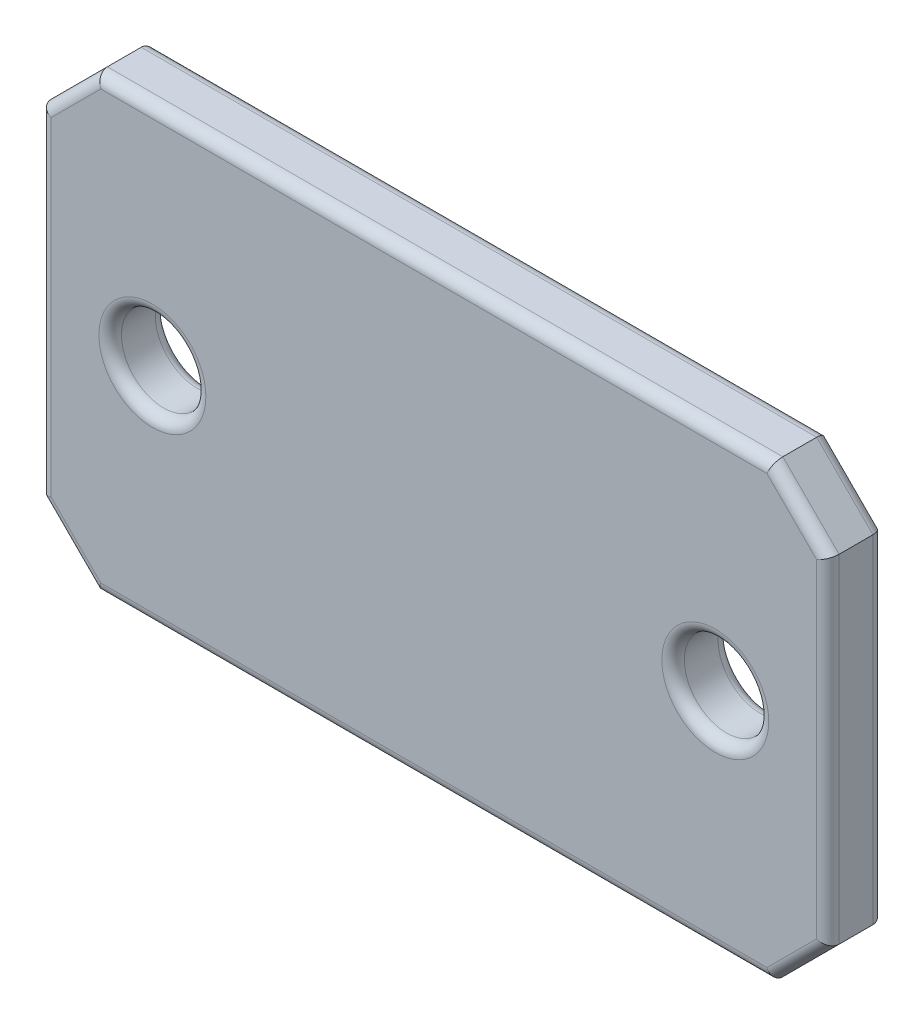
ISO-10303-21;
HEADER;
FILE_DESCRIPTION(('STEP AP214'),'2;1');
FILE_NAME('part.step','',(''),(''),'','','');
FILE_SCHEMA(('AUTOMOTIVE_DESIGN { 1 0 10303 214 1 1 1 1 }'));
ENDSEC;
DATA;
#1=APPLICATION_CONTEXT('core data for automotive mechanical design processes');
#2=APPLICATION_PROTOCOL_DEFINITION('international standard','automotive_design',2000,#1);
#3=PRODUCT_CONTEXT('',#1,'mechanical');
#4=PRODUCT('Part','Part','',(#3));
#5=PRODUCT_RELATED_PRODUCT_CATEGORY('part','',(#4));
#6=PRODUCT_DEFINITION_FORMATION('','',#4);
#7=PRODUCT_DEFINITION_CONTEXT('part definition',#1,'design');
#8=PRODUCT_DEFINITION('design','',#6,#7);
#9=PRODUCT_DEFINITION_SHAPE('','',#8);
#10=(LENGTH_UNIT() NAMED_UNIT(*) SI_UNIT(.MILLI.,.METRE.));
#11=(NAMED_UNIT(*) PLANE_ANGLE_UNIT() SI_UNIT($,.RADIAN.));
#12=(NAMED_UNIT(*) SI_UNIT($,.STERADIAN.) SOLID_ANGLE_UNIT());
#13=UNCERTAINTY_MEASURE_WITH_UNIT(LENGTH_MEASURE(1.E-05),#10,'distance_accuracy_value','');
#14=(GEOMETRIC_REPRESENTATION_CONTEXT(3) GLOBAL_UNCERTAINTY_ASSIGNED_CONTEXT((#13)) GLOBAL_UNIT_ASSIGNED_CONTEXT((#10,
#11,#12)) REPRESENTATION_CONTEXT('',''));
#15=CARTESIAN_POINT('',(0.,0.,0.));
#16=DIRECTION('',(0.,0.,1.));
#17=DIRECTION('',(1.,0.,0.));
#18=AXIS2_PLACEMENT_3D('',#15,#16,#17);
#19=CARTESIAN_POINT('',(22.225,9.52499999999999,3.175));
#20=DIRECTION('',(-0.707106781186548,-0.707106781186547,0.));
#21=DIRECTION('',(0.707106781186547,-0.707106781186548,0.));
#22=AXIS2_PLACEMENT_3D('',#19,#20,#21);
#23=PLANE('',#22);
#24=DIRECTION('',(0.,0.,-1.));
#25=VECTOR('',#24,1.);
#26=CARTESIAN_POINT('',(22.225,9.52499999999999,3.175));
#27=LINE('',#26,#25);
#28=CARTESIAN_POINT('',(22.225,9.52499999999999,2.54));
#29=VERTEX_POINT('',#28);
#30=CARTESIAN_POINT('',(22.225,9.52499999999999,0.635));
#31=VERTEX_POINT('',#30);
#32=EDGE_CURVE('E291',#29,#31,#27,.T.);
#33=ORIENTED_EDGE('',*,*,#32,.T.);
#34=DIRECTION('',(-0.707106781186547,0.707106781186548,0.));
#35=VECTOR('',#34,1.);
#36=CARTESIAN_POINT('',(22.225,9.52499999999999,0.635));
#37=LINE('',#36,#35);
#38=CARTESIAN_POINT('',(19.05,12.7,0.635));
#39=VERTEX_POINT('',#38);
#40=EDGE_CURVE('E238',#31,#39,#37,.T.);
#41=ORIENTED_EDGE('',*,*,#40,.T.);
#42=DIRECTION('',(0.,0.,-1.));
#43=VECTOR('',#42,1.);
#44=CARTESIAN_POINT('',(19.05,12.7,3.175));
#45=LINE('',#44,#43);
#46=CARTESIAN_POINT('',(19.05,12.7,2.54));
#47=VERTEX_POINT('',#46);
#48=EDGE_CURVE('E171',#47,#39,#45,.T.);
#49=ORIENTED_EDGE('',*,*,#48,.F.);
#50=DIRECTION('',(-0.707106781186547,0.707106781186548,0.));
#51=VECTOR('',#50,1.);
#52=CARTESIAN_POINT('',(22.225,9.52499999999999,2.54));
#53=LINE('',#52,#51);
#54=EDGE_CURVE('E236',#47,#29,#53,.F.);
#55=ORIENTED_EDGE('',*,*,#54,.T.);
#56=EDGE_LOOP('',(#33,#41,#49,#55));
#57=FACE_BOUND('',#56,.T.);
#58=ADVANCED_FACE('F35',(#57),#23,.F.);
#59=CARTESIAN_POINT('',(19.05,12.7,3.175));
#60=DIRECTION('',(0.,-1.,0.));
#61=DIRECTION('',(0.,0.,-1.));
#62=AXIS2_PLACEMENT_3D('',#59,#60,#61);
#63=PLANE('',#62);
#64=ORIENTED_EDGE('',*,*,#48,.T.);
#65=DIRECTION('',(-1.,0.,0.));
#66=VECTOR('',#65,1.);
#67=CARTESIAN_POINT('',(19.05,12.7,0.635));
#68=LINE('',#67,#66);
#69=CARTESIAN_POINT('',(-19.05,12.7,0.635));
#70=VERTEX_POINT('',#69);
#71=EDGE_CURVE('E170',#39,#70,#68,.T.);
#72=ORIENTED_EDGE('',*,*,#71,.T.);
#73=DIRECTION('',(0.,0.,-1.));
#74=VECTOR('',#73,1.);
#75=CARTESIAN_POINT('',(-19.05,12.7,3.175));
#76=LINE('',#75,#74);
#77=CARTESIAN_POINT('',(-19.05,12.7,2.54));
#78=VERTEX_POINT('',#77);
#79=EDGE_CURVE('E152',#78,#70,#76,.T.);
#80=ORIENTED_EDGE('',*,*,#79,.F.);
#81=DIRECTION('',(-1.,0.,0.));
#82=VECTOR('',#81,1.);
#83=CARTESIAN_POINT('',(19.05,12.7,2.54));
#84=LINE('',#83,#82);
#85=EDGE_CURVE('E167',#78,#47,#84,.F.);
#86=ORIENTED_EDGE('',*,*,#85,.T.);
#87=EDGE_LOOP('',(#64,#72,#80,#86));
#88=FACE_BOUND('',#87,.T.);
#89=ADVANCED_FACE('F165',(#88),#63,.F.);
#90=CARTESIAN_POINT('',(-19.05,12.7,3.175));
#91=DIRECTION('',(0.707106781186547,-0.707106781186548,0.));
#92=DIRECTION('',(0.707106781186548,0.707106781186547,0.));
#93=AXIS2_PLACEMENT_3D('',#90,#91,#92);
#94=PLANE('',#93);
#95=ORIENTED_EDGE('',*,*,#79,.T.);
#96=DIRECTION('',(-0.707106781186548,-0.707106781186547,0.));
#97=VECTOR('',#96,1.);
#98=CARTESIAN_POINT('',(-19.05,12.7,0.635));
#99=LINE('',#98,#97);
#100=CARTESIAN_POINT('',(-22.225,9.525,0.635));
#101=VERTEX_POINT('',#100);
#102=EDGE_CURVE('E159',#70,#101,#99,.T.);
#103=ORIENTED_EDGE('',*,*,#102,.T.);
#104=DIRECTION('',(0.,0.,-1.));
#105=VECTOR('',#104,1.);
#106=CARTESIAN_POINT('',(-22.225,9.525,3.175));
#107=LINE('',#106,#105);
#108=CARTESIAN_POINT('',(-22.225,9.525,2.54));
#109=VERTEX_POINT('',#108);
#110=EDGE_CURVE('E154',#109,#101,#107,.T.);
#111=ORIENTED_EDGE('',*,*,#110,.F.);
#112=DIRECTION('',(-0.707106781186548,-0.707106781186547,0.));
#113=VECTOR('',#112,1.);
#114=CARTESIAN_POINT('',(-19.05,12.7,2.54));
#115=LINE('',#114,#113);
#116=EDGE_CURVE('E149',#109,#78,#115,.F.);
#117=ORIENTED_EDGE('',*,*,#116,.T.);
#118=EDGE_LOOP('',(#95,#103,#111,#117));
#119=FACE_BOUND('',#118,.T.);
#120=ADVANCED_FACE('F151',(#119),#94,.F.);
#121=CARTESIAN_POINT('',(-22.225,9.525,3.175));
#122=DIRECTION('',(1.,0.,0.));
#123=DIRECTION('',(0.,0.,-1.));
#124=AXIS2_PLACEMENT_3D('',#121,#122,#123);
#125=PLANE('',#124);
#126=ORIENTED_EDGE('',*,*,#110,.T.);
#127=DIRECTION('',(0.,-1.,0.));
#128=VECTOR('',#127,1.);
#129=CARTESIAN_POINT('',(-22.225,9.525,0.635));
#130=LINE('',#129,#128);
#131=CARTESIAN_POINT('',(-22.225,-9.52499999999998,0.635));
#132=VERTEX_POINT('',#131);
#133=EDGE_CURVE('E217',#101,#132,#130,.T.);
#134=ORIENTED_EDGE('',*,*,#133,.T.);
#135=DIRECTION('',(0.,0.,-1.));
#136=VECTOR('',#135,1.);
#137=CARTESIAN_POINT('',(-22.225,-9.52499999999998,3.175));
#138=LINE('',#137,#136);
#139=CARTESIAN_POINT('',(-22.225,-9.52499999999998,2.54));
#140=VERTEX_POINT('',#139);
#141=EDGE_CURVE('E317',#140,#132,#138,.T.);
#142=ORIENTED_EDGE('',*,*,#141,.F.);
#143=DIRECTION('',(0.,-1.,0.));
#144=VECTOR('',#143,1.);
#145=CARTESIAN_POINT('',(-22.225,9.525,2.54));
#146=LINE('',#145,#144);
#147=EDGE_CURVE('E215',#140,#109,#146,.F.);
#148=ORIENTED_EDGE('',*,*,#147,.T.);
#149=EDGE_LOOP('',(#126,#134,#142,#148));
#150=FACE_BOUND('',#149,.T.);
#151=ADVANCED_FACE('F314',(#150),#125,.F.);
#152=CARTESIAN_POINT('',(-22.225,-9.52499999999998,3.175));
#153=DIRECTION('',(0.707106781186548,0.707106781186547,0.));
#154=DIRECTION('',(-0.707106781186547,0.707106781186548,0.));
#155=AXIS2_PLACEMENT_3D('',#152,#153,#154);
#156=PLANE('',#155);
#157=ORIENTED_EDGE('',*,*,#141,.T.);
#158=DIRECTION('',(0.707106781186547,-0.707106781186548,0.));
#159=VECTOR('',#158,1.);
#160=CARTESIAN_POINT('',(-22.225,-9.52499999999998,0.635));
#161=LINE('',#160,#159);
#162=CARTESIAN_POINT('',(-19.05,-12.7,0.635));
#163=VERTEX_POINT('',#162);
#164=EDGE_CURVE('E221',#132,#163,#161,.T.);
#165=ORIENTED_EDGE('',*,*,#164,.T.);
#166=DIRECTION('',(0.,0.,-1.));
#167=VECTOR('',#166,1.);
#168=CARTESIAN_POINT('',(-19.05,-12.7,3.175));
#169=LINE('',#168,#167);
#170=CARTESIAN_POINT('',(-19.05,-12.7,2.54));
#171=VERTEX_POINT('',#170);
#172=EDGE_CURVE('E320',#171,#163,#169,.T.);
#173=ORIENTED_EDGE('',*,*,#172,.F.);
#174=DIRECTION('',(0.707106781186547,-0.707106781186548,0.));
#175=VECTOR('',#174,1.);
#176=CARTESIAN_POINT('',(-22.225,-9.52499999999998,2.54));
#177=LINE('',#176,#175);
#178=EDGE_CURVE('E219',#171,#140,#177,.F.);
#179=ORIENTED_EDGE('',*,*,#178,.T.);
#180=EDGE_LOOP('',(#157,#165,#173,#179));
#181=FACE_BOUND('',#180,.T.);
#182=ADVANCED_FACE('F365',(#181),#156,.F.);
#183=CARTESIAN_POINT('',(-19.05,-12.7,3.175));
#184=DIRECTION('',(0.,1.,0.));
#185=DIRECTION('',(0.,0.,1.));
#186=AXIS2_PLACEMENT_3D('',#183,#184,#185);
#187=PLANE('',#186);
#188=ORIENTED_EDGE('',*,*,#172,.T.);
#189=DIRECTION('',(1.,0.,0.));
#190=VECTOR('',#189,1.);
#191=CARTESIAN_POINT('',(-19.05,-12.7,0.635));
#192=LINE('',#191,#190);
#193=CARTESIAN_POINT('',(19.05,-12.7,0.635));
#194=VERTEX_POINT('',#193);
#195=EDGE_CURVE('E225',#163,#194,#192,.T.);
#196=ORIENTED_EDGE('',*,*,#195,.T.);
#197=DIRECTION('',(0.,0.,-1.));
#198=VECTOR('',#197,1.);
#199=CARTESIAN_POINT('',(19.05,-12.7,3.175));
#200=LINE('',#199,#198);
#201=CARTESIAN_POINT('',(19.05,-12.7,2.54));
#202=VERTEX_POINT('',#201);
#203=EDGE_CURVE('E324',#202,#194,#200,.T.);
#204=ORIENTED_EDGE('',*,*,#203,.F.);
#205=DIRECTION('',(1.,0.,0.));
#206=VECTOR('',#205,1.);
#207=CARTESIAN_POINT('',(-19.05,-12.7,2.54));
#208=LINE('',#207,#206);
#209=EDGE_CURVE('E223',#202,#171,#208,.F.);
#210=ORIENTED_EDGE('',*,*,#209,.T.);
#211=EDGE_LOOP('',(#188,#196,#204,#210));
#212=FACE_BOUND('',#211,.T.);
#213=ADVANCED_FACE('F368',(#212),#187,.F.);
#214=CARTESIAN_POINT('',(19.05,-12.7,3.175));
#215=DIRECTION('',(-0.707106781186547,0.707106781186548,0.));
#216=DIRECTION('',(-0.707106781186548,-0.707106781186547,0.));
#217=AXIS2_PLACEMENT_3D('',#214,#215,#216);
#218=PLANE('',#217);
#219=ORIENTED_EDGE('',*,*,#203,.T.);
#220=DIRECTION('',(0.707106781186548,0.707106781186547,0.));
#221=VECTOR('',#220,1.);
#222=CARTESIAN_POINT('',(19.05,-12.7,0.635));
#223=LINE('',#222,#221);
#224=CARTESIAN_POINT('',(22.225,-9.525,0.635));
#225=VERTEX_POINT('',#224);
#226=EDGE_CURVE('E229',#194,#225,#223,.T.);
#227=ORIENTED_EDGE('',*,*,#226,.T.);
#228=DIRECTION('',(0.,0.,-1.));
#229=VECTOR('',#228,1.);
#230=CARTESIAN_POINT('',(22.225,-9.525,3.175));
#231=LINE('',#230,#229);
#232=CARTESIAN_POINT('',(22.225,-9.525,2.54));
#233=VERTEX_POINT('',#232);
#234=EDGE_CURVE('E329',#233,#225,#231,.T.);
#235=ORIENTED_EDGE('',*,*,#234,.F.);
#236=DIRECTION('',(0.707106781186548,0.707106781186547,0.));
#237=VECTOR('',#236,1.);
#238=CARTESIAN_POINT('',(19.05,-12.7,2.54));
#239=LINE('',#238,#237);
#240=EDGE_CURVE('E227',#233,#202,#239,.F.);
#241=ORIENTED_EDGE('',*,*,#240,.T.);
#242=EDGE_LOOP('',(#219,#227,#235,#241));
#243=FACE_BOUND('',#242,.T.);
#244=ADVANCED_FACE('F382',(#243),#218,.F.);
#245=CARTESIAN_POINT('',(22.225,-9.525,3.175));
#246=DIRECTION('',(-1.,0.,0.));
#247=DIRECTION('',(0.,-1.,0.));
#248=AXIS2_PLACEMENT_3D('',#245,#246,#247);
#249=PLANE('',#248);
#250=ORIENTED_EDGE('',*,*,#234,.T.);
#251=DIRECTION('',(0.,1.,0.));
#252=VECTOR('',#251,1.);
#253=CARTESIAN_POINT('',(22.225,-9.525,0.635));
#254=LINE('',#253,#252);
#255=EDGE_CURVE('E234',#225,#31,#254,.T.);
#256=ORIENTED_EDGE('',*,*,#255,.T.);
#257=ORIENTED_EDGE('',*,*,#32,.F.);
#258=DIRECTION('',(0.,1.,0.));
#259=VECTOR('',#258,1.);
#260=CARTESIAN_POINT('',(22.225,-9.525,2.54));
#261=LINE('',#260,#259);
#262=EDGE_CURVE('E231',#29,#233,#261,.F.);
#263=ORIENTED_EDGE('',*,*,#262,.T.);
#264=EDGE_LOOP('',(#250,#256,#257,#263));
#265=FACE_BOUND('',#264,.T.);
#266=ADVANCED_FACE('F383',(#265),#249,.F.);
#267=CARTESIAN_POINT('',(0.,0.,3.175));
#268=DIRECTION('',(0.,0.,1.));
#269=DIRECTION('',(1.,0.,0.));
#270=AXIS2_PLACEMENT_3D('',#267,#268,#269);
#271=PLANE('',#270);
#272=DIRECTION('',(0.707106781186548,0.707106781186547,0.));
#273=VECTOR('',#272,1.);
#274=CARTESIAN_POINT('',(21.7759871939465,-9.07598719394654,3.175));
#275=LINE('',#274,#273);
#276=CARTESIAN_POINT('',(18.7869743878931,-12.065,3.175));
#277=VERTEX_POINT('',#276);
#278=CARTESIAN_POINT('',(21.59,-9.26197438789309,3.175));
#279=VERTEX_POINT('',#278);
#280=EDGE_CURVE('E44',#277,#279,#275,.T.);
#281=ORIENTED_EDGE('',*,*,#280,.T.);
#282=DIRECTION('',(0.,1.,0.));
#283=VECTOR('',#282,1.);
#284=CARTESIAN_POINT('',(21.59,9.52499999999999,3.175));
#285=LINE('',#284,#283);
#286=CARTESIAN_POINT('',(21.59,9.26197438789307,3.175));
#287=VERTEX_POINT('',#286);
#288=EDGE_CURVE('E11',#279,#287,#285,.T.);
#289=ORIENTED_EDGE('',*,*,#288,.T.);
#290=DIRECTION('',(-0.707106781186547,0.707106781186548,0.));
#291=VECTOR('',#290,1.);
#292=CARTESIAN_POINT('',(18.6009871939465,12.2509871939465,3.175));
#293=LINE('',#292,#291);
#294=CARTESIAN_POINT('',(18.7869743878931,12.065,3.175));
#295=VERTEX_POINT('',#294);
#296=EDGE_CURVE('E258',#287,#295,#293,.T.);
#297=ORIENTED_EDGE('',*,*,#296,.T.);
#298=DIRECTION('',(-1.,0.,0.));
#299=VECTOR('',#298,1.);
#300=CARTESIAN_POINT('',(-19.05,12.065,3.175));
#301=LINE('',#300,#299);
#302=CARTESIAN_POINT('',(-18.7869743878931,12.065,3.175));
#303=VERTEX_POINT('',#302);
#304=EDGE_CURVE('E260',#295,#303,#301,.T.);
#305=ORIENTED_EDGE('',*,*,#304,.T.);
#306=DIRECTION('',(-0.707106781186548,-0.707106781186547,0.));
#307=VECTOR('',#306,1.);
#308=CARTESIAN_POINT('',(-21.7759871939465,9.07598719394654,3.175));
#309=LINE('',#308,#307);
#310=CARTESIAN_POINT('',(-21.59,9.26197438789308,3.175));
#311=VERTEX_POINT('',#310);
#312=EDGE_CURVE('E177',#303,#311,#309,.T.);
#313=ORIENTED_EDGE('',*,*,#312,.T.);
#314=DIRECTION('',(0.,-1.,0.));
#315=VECTOR('',#314,1.);
#316=CARTESIAN_POINT('',(-21.59,-9.52499999999998,3.175));
#317=LINE('',#316,#315);
#318=CARTESIAN_POINT('',(-21.59,-9.26197438789307,3.175));
#319=VERTEX_POINT('',#318);
#320=EDGE_CURVE('E263',#311,#319,#317,.T.);
#321=ORIENTED_EDGE('',*,*,#320,.T.);
#322=DIRECTION('',(0.707106781186547,-0.707106781186548,0.));
#323=VECTOR('',#322,1.);
#324=CARTESIAN_POINT('',(-18.6009871939465,-12.2509871939465,3.175));
#325=LINE('',#324,#323);
#326=CARTESIAN_POINT('',(-18.7869743878931,-12.065,3.175));
#327=VERTEX_POINT('',#326);
#328=EDGE_CURVE('E265',#319,#327,#325,.T.);
#329=ORIENTED_EDGE('',*,*,#328,.T.);
#330=DIRECTION('',(1.,0.,0.));
#331=VECTOR('',#330,1.);
#332=CARTESIAN_POINT('',(19.05,-12.065,3.175));
#333=LINE('',#332,#331);
#334=EDGE_CURVE('E55',#327,#277,#333,.T.);
#335=ORIENTED_EDGE('',*,*,#334,.T.);
#336=EDGE_LOOP('',(#281,#289,#297,#305,#313,#321,#329,#335));
#337=FACE_BOUND('',#336,.T.);
#338=CARTESIAN_POINT('',(-15.875,0.,3.175));
#339=DIRECTION('',(0.,0.,1.));
#340=DIRECTION('',(1.,0.,0.));
#341=AXIS2_PLACEMENT_3D('',#338,#339,#340);
#342=CIRCLE('',#341,3.01624999999999);
#343=CARTESIAN_POINT('',(-12.85875,0.,3.175));
#344=VERTEX_POINT('',#343);
#345=EDGE_CURVE('E255',#344,#344,#342,.F.);
#346=ORIENTED_EDGE('',*,*,#345,.T.);
#347=EDGE_LOOP('',(#346));
#348=FACE_BOUND('',#347,.T.);
#349=CARTESIAN_POINT('',(15.875,0.,3.175));
#350=DIRECTION('',(0.,0.,1.));
#351=DIRECTION('',(1.,0.,0.));
#352=AXIS2_PLACEMENT_3D('',#349,#350,#351);
#353=CIRCLE('',#352,3.01624999999999);
#354=CARTESIAN_POINT('',(18.89125,0.,3.175));
#355=VERTEX_POINT('',#354);
#356=EDGE_CURVE('E252',#355,#355,#353,.F.);
#357=ORIENTED_EDGE('',*,*,#356,.T.);
#358=EDGE_LOOP('',(#357));
#359=FACE_BOUND('',#358,.T.);
#360=ADVANCED_FACE('F392',(#337,#348,#359),#271,.T.);
#361=CARTESIAN_POINT('',(0.,0.,0.));
#362=DIRECTION('',(0.,0.,1.));
#363=DIRECTION('',(1.,0.,0.));
#364=AXIS2_PLACEMENT_3D('',#361,#362,#363);
#365=PLANE('',#364);
#366=DIRECTION('',(-0.707106781186548,-0.707106781186547,0.));
#367=VECTOR('',#366,1.);
#368=CARTESIAN_POINT('',(-15.4259871939465,15.4259871939466,0.));
#369=LINE('',#368,#367);
#370=CARTESIAN_POINT('',(-21.59,9.26197438789308,0.));
#371=VERTEX_POINT('',#370);
#372=CARTESIAN_POINT('',(-18.7869743878931,12.065,0.));
#373=VERTEX_POINT('',#372);
#374=EDGE_CURVE('E210',#371,#373,#369,.F.);
#375=ORIENTED_EDGE('',*,*,#374,.T.);
#376=DIRECTION('',(-1.,0.,0.));
#377=VECTOR('',#376,1.);
#378=CARTESIAN_POINT('',(0.,12.065,0.));
#379=LINE('',#378,#377);
#380=CARTESIAN_POINT('',(18.7869743878931,12.065,0.));
#381=VERTEX_POINT('',#380);
#382=EDGE_CURVE('E160',#373,#381,#379,.F.);
#383=ORIENTED_EDGE('',*,*,#382,.T.);
#384=DIRECTION('',(-0.707106781186547,0.707106781186548,0.));
#385=VECTOR('',#384,1.);
#386=CARTESIAN_POINT('',(15.4259871939466,15.4259871939465,0.));
#387=LINE('',#386,#385);
#388=CARTESIAN_POINT('',(21.59,9.26197438789308,0.));
#389=VERTEX_POINT('',#388);
#390=EDGE_CURVE('E198',#381,#389,#387,.F.);
#391=ORIENTED_EDGE('',*,*,#390,.T.);
#392=DIRECTION('',(0.,1.,0.));
#393=VECTOR('',#392,1.);
#394=CARTESIAN_POINT('',(21.59,0.,0.));
#395=LINE('',#394,#393);
#396=CARTESIAN_POINT('',(21.59,-9.26197438789308,0.));
#397=VERTEX_POINT('',#396);
#398=EDGE_CURVE('E200',#389,#397,#395,.F.);
#399=ORIENTED_EDGE('',*,*,#398,.T.);
#400=DIRECTION('',(0.707106781186548,0.707106781186547,0.));
#401=VECTOR('',#400,1.);
#402=CARTESIAN_POINT('',(15.4259871939465,-15.4259871939465,0.));
#403=LINE('',#402,#401);
#404=CARTESIAN_POINT('',(18.7869743878931,-12.065,0.));
#405=VERTEX_POINT('',#404);
#406=EDGE_CURVE('E202',#397,#405,#403,.F.);
#407=ORIENTED_EDGE('',*,*,#406,.T.);
#408=DIRECTION('',(1.,0.,0.));
#409=VECTOR('',#408,1.);
#410=CARTESIAN_POINT('',(0.,-12.065,0.));
#411=LINE('',#410,#409);
#412=CARTESIAN_POINT('',(-18.7869743878931,-12.065,0.));
#413=VERTEX_POINT('',#412);
#414=EDGE_CURVE('E204',#405,#413,#411,.F.);
#415=ORIENTED_EDGE('',*,*,#414,.T.);
#416=DIRECTION('',(0.707106781186547,-0.707106781186548,0.));
#417=VECTOR('',#416,1.);
#418=CARTESIAN_POINT('',(-15.4259871939466,-15.4259871939465,0.));
#419=LINE('',#418,#417);
#420=CARTESIAN_POINT('',(-21.59,-9.26197438789307,0.));
#421=VERTEX_POINT('',#420);
#422=EDGE_CURVE('E206',#413,#421,#419,.F.);
#423=ORIENTED_EDGE('',*,*,#422,.T.);
#424=DIRECTION('',(0.,-1.,0.));
#425=VECTOR('',#424,1.);
#426=CARTESIAN_POINT('',(-21.59,0.,0.));
#427=LINE('',#426,#425);
#428=EDGE_CURVE('E208',#421,#371,#427,.F.);
#429=ORIENTED_EDGE('',*,*,#428,.T.);
#430=EDGE_LOOP('',(#375,#383,#391,#399,#407,#415,#423,#429));
#431=FACE_BOUND('',#430,.T.);
#432=CARTESIAN_POINT('',(-15.875,0.,0.));
#433=DIRECTION('',(0.,0.,1.));
#434=DIRECTION('',(1.,0.,0.));
#435=AXIS2_PLACEMENT_3D('',#432,#433,#434);
#436=CIRCLE('',#435,3.01624999999999);
#437=CARTESIAN_POINT('',(-12.85875,0.,0.));
#438=VERTEX_POINT('',#437);
#439=EDGE_CURVE('E195',#438,#438,#436,.T.);
#440=ORIENTED_EDGE('',*,*,#439,.T.);
#441=EDGE_LOOP('',(#440));
#442=FACE_BOUND('',#441,.T.);
#443=CARTESIAN_POINT('',(15.875,0.,0.));
#444=DIRECTION('',(0.,0.,1.));
#445=DIRECTION('',(1.,0.,0.));
#446=AXIS2_PLACEMENT_3D('',#443,#444,#445);
#447=CIRCLE('',#446,3.01624999999999);
#448=CARTESIAN_POINT('',(18.89125,0.,0.));
#449=VERTEX_POINT('',#448);
#450=EDGE_CURVE('E189',#449,#449,#447,.T.);
#451=ORIENTED_EDGE('',*,*,#450,.T.);
#452=EDGE_LOOP('',(#451));
#453=FACE_BOUND('',#452,.T.);
#454=ADVANCED_FACE('F395',(#431,#442,#453),#365,.F.);
#455=CARTESIAN_POINT('',(-15.875,0.,3.175));
#456=DIRECTION('',(0.,0.,1.));
#457=DIRECTION('',(1.,0.,0.));
#458=AXIS2_PLACEMENT_3D('',#455,#456,#457);
#459=CYLINDRICAL_SURFACE('',#458,2.38124999999999);
#460=CARTESIAN_POINT('',(-15.875,0.,0.635));
#461=DIRECTION('',(0.,0.,1.));
#462=DIRECTION('',(1.,0.,0.));
#463=AXIS2_PLACEMENT_3D('',#460,#461,#462);
#464=CIRCLE('',#463,2.38124999999999);
#465=CARTESIAN_POINT('',(-13.49375,0.,0.635));
#466=VERTEX_POINT('',#465);
#467=EDGE_CURVE('E243',#466,#466,#464,.F.);
#468=ORIENTED_EDGE('',*,*,#467,.T.);
#469=EDGE_LOOP('',(#468));
#470=FACE_BOUND('',#469,.T.);
#471=CARTESIAN_POINT('',(-15.875,0.,2.54));
#472=DIRECTION('',(0.,0.,1.));
#473=DIRECTION('',(1.,0.,0.));
#474=AXIS2_PLACEMENT_3D('',#471,#472,#473);
#475=CIRCLE('',#474,2.38124999999999);
#476=CARTESIAN_POINT('',(-13.49375,0.,2.54));
#477=VERTEX_POINT('',#476);
#478=EDGE_CURVE('E240',#477,#477,#475,.T.);
#479=ORIENTED_EDGE('',*,*,#478,.T.);
#480=EDGE_LOOP('',(#479));
#481=FACE_BOUND('',#480,.T.);
#482=ADVANCED_FACE('F408',(#470,#481),#459,.F.);
#483=CARTESIAN_POINT('',(15.875,0.,3.175));
#484=DIRECTION('',(0.,0.,1.));
#485=DIRECTION('',(1.,0.,0.));
#486=AXIS2_PLACEMENT_3D('',#483,#484,#485);
#487=CYLINDRICAL_SURFACE('',#486,2.38124999999999);
#488=CARTESIAN_POINT('',(15.875,0.,0.635));
#489=DIRECTION('',(0.,0.,1.));
#490=DIRECTION('',(1.,0.,0.));
#491=AXIS2_PLACEMENT_3D('',#488,#489,#490);
#492=CIRCLE('',#491,2.38124999999999);
#493=CARTESIAN_POINT('',(18.25625,0.,0.635));
#494=VERTEX_POINT('',#493);
#495=EDGE_CURVE('E249',#494,#494,#492,.F.);
#496=ORIENTED_EDGE('',*,*,#495,.T.);
#497=EDGE_LOOP('',(#496));
#498=FACE_BOUND('',#497,.T.);
#499=CARTESIAN_POINT('',(15.875,0.,2.54));
#500=DIRECTION('',(0.,0.,1.));
#501=DIRECTION('',(1.,0.,0.));
#502=AXIS2_PLACEMENT_3D('',#499,#500,#501);
#503=CIRCLE('',#502,2.38124999999999);
#504=CARTESIAN_POINT('',(18.25625,0.,2.54));
#505=VERTEX_POINT('',#504);
#506=EDGE_CURVE('E246',#505,#505,#503,.T.);
#507=ORIENTED_EDGE('',*,*,#506,.T.);
#508=EDGE_LOOP('',(#507));
#509=FACE_BOUND('',#508,.T.);
#510=ADVANCED_FACE('F406',(#498,#509),#487,.F.);
#511=CARTESIAN_POINT('',(-19.05,-12.065,0.635));
#512=DIRECTION('',(1.,0.,0.));
#513=DIRECTION('',(0.,0.,-1.));
#514=AXIS2_PLACEMENT_3D('',#511,#512,#513);
#515=CYLINDRICAL_SURFACE('',#514,0.635);
#516=CARTESIAN_POINT('',(-18.7869743878931,-12.065,0.635));
#517=DIRECTION('',(0.923879532511287,-0.38268343236509,0.));
#518=DIRECTION('',(0.38268343236509,0.923879532511286,0.));
#519=AXIS2_PLACEMENT_3D('',#516,#517,#518);
#520=ELLIPSE('',#519,0.68731904718567,0.635);
#521=EDGE_CURVE('E285',#413,#163,#520,.F.);
#522=ORIENTED_EDGE('',*,*,#521,.F.);
#523=ORIENTED_EDGE('',*,*,#414,.F.);
#524=CARTESIAN_POINT('',(18.7869743878931,-12.065,0.635));
#525=DIRECTION('',(0.923879532511287,0.382683432365089,0.));
#526=DIRECTION('',(-0.382683432365089,0.923879532511287,0.));
#527=AXIS2_PLACEMENT_3D('',#524,#525,#526);
#528=ELLIPSE('',#527,0.68731904718567,0.635);
#529=EDGE_CURVE('E288',#194,#405,#528,.T.);
#530=ORIENTED_EDGE('',*,*,#529,.F.);
#531=ORIENTED_EDGE('',*,*,#195,.F.);
#532=EDGE_LOOP('',(#522,#523,#530,#531));
#533=FACE_BOUND('',#532,.T.);
#534=ADVANCED_FACE('F373',(#533),#515,.T.);
#535=CARTESIAN_POINT('',(18.6009871939465,-12.2509871939465,0.635));
#536=DIRECTION('',(0.707106781186548,0.707106781186547,0.));
#537=DIRECTION('',(-0.707106781186547,0.707106781186548,0.));
#538=AXIS2_PLACEMENT_3D('',#535,#536,#537);
#539=CYLINDRICAL_SURFACE('',#538,0.635);
#540=ORIENTED_EDGE('',*,*,#529,.T.);
#541=ORIENTED_EDGE('',*,*,#406,.F.);
#542=CARTESIAN_POINT('',(21.59,-9.26197438789308,0.635));
#543=DIRECTION('',(0.38268343236509,0.923879532511287,0.));
#544=DIRECTION('',(-0.923879532511287,0.38268343236509,0.));
#545=AXIS2_PLACEMENT_3D('',#542,#543,#544);
#546=ELLIPSE('',#545,0.68731904718567,0.635);
#547=EDGE_CURVE('E282',#225,#397,#546,.T.);
#548=ORIENTED_EDGE('',*,*,#547,.F.);
#549=ORIENTED_EDGE('',*,*,#226,.F.);
#550=EDGE_LOOP('',(#540,#541,#548,#549));
#551=FACE_BOUND('',#550,.T.);
#552=ADVANCED_FACE('F379',(#551),#539,.T.);
#553=CARTESIAN_POINT('',(-21.7759871939465,-9.07598719394653,0.635));
#554=DIRECTION('',(0.707106781186547,-0.707106781186548,0.));
#555=DIRECTION('',(0.707106781186548,0.707106781186547,0.));
#556=AXIS2_PLACEMENT_3D('',#553,#554,#555);
#557=CYLINDRICAL_SURFACE('',#556,0.635);
#558=ORIENTED_EDGE('',*,*,#521,.T.);
#559=ORIENTED_EDGE('',*,*,#164,.F.);
#560=CARTESIAN_POINT('',(-21.59,-9.26197438789307,0.635));
#561=DIRECTION('',(0.382683432365089,-0.923879532511287,0.));
#562=DIRECTION('',(0.923879532511287,0.382683432365089,0.));
#563=AXIS2_PLACEMENT_3D('',#560,#561,#562);
#564=ELLIPSE('',#563,0.68731904718567,0.635);
#565=EDGE_CURVE('E279',#421,#132,#564,.F.);
#566=ORIENTED_EDGE('',*,*,#565,.F.);
#567=ORIENTED_EDGE('',*,*,#422,.F.);
#568=EDGE_LOOP('',(#558,#559,#566,#567));
#569=FACE_BOUND('',#568,.T.);
#570=ADVANCED_FACE('F362',(#569),#557,.T.);
#571=CARTESIAN_POINT('',(21.59,-9.525,0.635));
#572=DIRECTION('',(0.,1.,0.));
#573=DIRECTION('',(-1.,0.,0.));
#574=AXIS2_PLACEMENT_3D('',#571,#572,#573);
#575=CYLINDRICAL_SURFACE('',#574,0.635);
#576=ORIENTED_EDGE('',*,*,#547,.T.);
#577=ORIENTED_EDGE('',*,*,#398,.F.);
#578=CARTESIAN_POINT('',(21.59,9.26197438789307,0.635));
#579=DIRECTION('',(-0.382683432365089,0.923879532511287,0.));
#580=DIRECTION('',(-0.923879532511287,-0.382683432365089,0.));
#581=AXIS2_PLACEMENT_3D('',#578,#579,#580);
#582=ELLIPSE('',#581,0.68731904718567,0.635);
#583=EDGE_CURVE('E276',#31,#389,#582,.T.);
#584=ORIENTED_EDGE('',*,*,#583,.F.);
#585=ORIENTED_EDGE('',*,*,#255,.F.);
#586=EDGE_LOOP('',(#576,#577,#584,#585));
#587=FACE_BOUND('',#586,.T.);
#588=ADVANCED_FACE('F342',(#587),#575,.T.);
#589=CARTESIAN_POINT('',(-21.59,9.525,0.635));
#590=DIRECTION('',(0.,-1.,0.));
#591=DIRECTION('',(0.,0.,-1.));
#592=AXIS2_PLACEMENT_3D('',#589,#590,#591);
#593=CYLINDRICAL_SURFACE('',#592,0.635);
#594=ORIENTED_EDGE('',*,*,#565,.T.);
#595=ORIENTED_EDGE('',*,*,#133,.F.);
#596=CARTESIAN_POINT('',(-21.59,9.26197438789308,0.635));
#597=DIRECTION('',(-0.38268343236509,-0.923879532511287,0.));
#598=DIRECTION('',(0.923879532511286,-0.38268343236509,0.));
#599=AXIS2_PLACEMENT_3D('',#596,#597,#598);
#600=ELLIPSE('',#599,0.68731904718567,0.635);
#601=EDGE_CURVE('E273',#371,#101,#600,.F.);
#602=ORIENTED_EDGE('',*,*,#601,.F.);
#603=ORIENTED_EDGE('',*,*,#428,.F.);
#604=EDGE_LOOP('',(#594,#595,#602,#603));
#605=FACE_BOUND('',#604,.T.);
#606=ADVANCED_FACE('F358',(#605),#593,.T.);
#607=CARTESIAN_POINT('',(21.7759871939465,9.07598719394653,0.635));
#608=DIRECTION('',(-0.707106781186547,0.707106781186548,0.));
#609=DIRECTION('',(-0.707106781186548,-0.707106781186547,0.));
#610=AXIS2_PLACEMENT_3D('',#607,#608,#609);
#611=CYLINDRICAL_SURFACE('',#610,0.635);
#612=ORIENTED_EDGE('',*,*,#583,.T.);
#613=ORIENTED_EDGE('',*,*,#390,.F.);
#614=CARTESIAN_POINT('',(18.7869743878931,12.065,0.635));
#615=DIRECTION('',(-0.923879532511287,0.38268343236509,0.));
#616=DIRECTION('',(0.38268343236509,0.923879532511286,0.));
#617=AXIS2_PLACEMENT_3D('',#614,#615,#616);
#618=ELLIPSE('',#617,0.68731904718567,0.635);
#619=EDGE_CURVE('E271',#39,#381,#618,.T.);
#620=ORIENTED_EDGE('',*,*,#619,.F.);
#621=ORIENTED_EDGE('',*,*,#40,.F.);
#622=EDGE_LOOP('',(#612,#613,#620,#621));
#623=FACE_BOUND('',#622,.T.);
#624=ADVANCED_FACE('F346',(#623),#611,.T.);
#625=CARTESIAN_POINT('',(-18.6009871939465,12.2509871939465,0.635));
#626=DIRECTION('',(-0.707106781186548,-0.707106781186547,0.));
#627=DIRECTION('',(0.707106781186547,-0.707106781186548,0.));
#628=AXIS2_PLACEMENT_3D('',#625,#626,#627);
#629=CYLINDRICAL_SURFACE('',#628,0.635);
#630=ORIENTED_EDGE('',*,*,#601,.T.);
#631=ORIENTED_EDGE('',*,*,#102,.F.);
#632=CARTESIAN_POINT('',(-18.7869743878931,12.065,0.635));
#633=DIRECTION('',(-0.923879532511287,-0.382683432365089,0.));
#634=DIRECTION('',(0.382683432365089,-0.923879532511287,0.));
#635=AXIS2_PLACEMENT_3D('',#632,#633,#634);
#636=ELLIPSE('',#635,0.68731904718567,0.635);
#637=EDGE_CURVE('E269',#373,#70,#636,.F.);
#638=ORIENTED_EDGE('',*,*,#637,.F.);
#639=ORIENTED_EDGE('',*,*,#374,.F.);
#640=EDGE_LOOP('',(#630,#631,#638,#639));
#641=FACE_BOUND('',#640,.T.);
#642=ADVANCED_FACE('F354',(#641),#629,.T.);
#643=CARTESIAN_POINT('',(19.05,12.065,0.635));
#644=DIRECTION('',(-1.,0.,0.));
#645=DIRECTION('',(0.,0.,1.));
#646=AXIS2_PLACEMENT_3D('',#643,#644,#645);
#647=CYLINDRICAL_SURFACE('',#646,0.635);
#648=ORIENTED_EDGE('',*,*,#619,.T.);
#649=ORIENTED_EDGE('',*,*,#382,.F.);
#650=ORIENTED_EDGE('',*,*,#637,.T.);
#651=ORIENTED_EDGE('',*,*,#71,.F.);
#652=EDGE_LOOP('',(#648,#649,#650,#651));
#653=FACE_BOUND('',#652,.T.);
#654=ADVANCED_FACE('F349',(#653),#647,.T.);
#655=CARTESIAN_POINT('',(-15.875,0.,0.635));
#656=DIRECTION('',(0.,0.,1.));
#657=DIRECTION('',(1.,0.,0.));
#658=AXIS2_PLACEMENT_3D('',#655,#656,#657);
#659=TOROIDAL_SURFACE('',#658,3.01624999999999,0.635);
#660=ORIENTED_EDGE('',*,*,#467,.F.);
#661=EDGE_LOOP('',(#660));
#662=FACE_BOUND('',#661,.T.);
#663=ORIENTED_EDGE('',*,*,#439,.F.);
#664=EDGE_LOOP('',(#663));
#665=FACE_BOUND('',#664,.T.);
#666=ADVANCED_FACE('F428',(#662,#665),#659,.T.);
#667=CARTESIAN_POINT('',(15.875,0.,0.635));
#668=DIRECTION('',(0.,0.,1.));
#669=DIRECTION('',(1.,0.,0.));
#670=AXIS2_PLACEMENT_3D('',#667,#668,#669);
#671=TOROIDAL_SURFACE('',#670,3.01624999999999,0.635);
#672=ORIENTED_EDGE('',*,*,#495,.F.);
#673=EDGE_LOOP('',(#672));
#674=FACE_BOUND('',#673,.T.);
#675=ORIENTED_EDGE('',*,*,#450,.F.);
#676=EDGE_LOOP('',(#675));
#677=FACE_BOUND('',#676,.T.);
#678=ADVANCED_FACE('F443',(#674,#677),#671,.T.);
#679=CARTESIAN_POINT('',(-21.59,0.,2.54));
#680=DIRECTION('',(0.,1.,0.));
#681=DIRECTION('',(0.,0.,1.));
#682=AXIS2_PLACEMENT_3D('',#679,#680,#681);
#683=CYLINDRICAL_SURFACE('',#682,0.635);
#684=CARTESIAN_POINT('',(-21.59,9.26197438789308,2.54));
#685=DIRECTION('',(0.38268343236509,0.923879532511287,0.));
#686=DIRECTION('',(0.923879532511286,-0.38268343236509,0.));
#687=AXIS2_PLACEMENT_3D('',#684,#685,#686);
#688=ELLIPSE('',#687,0.68731904718567,0.635);
#689=EDGE_CURVE('E300',#109,#311,#688,.T.);
#690=ORIENTED_EDGE('',*,*,#689,.F.);
#691=ORIENTED_EDGE('',*,*,#147,.F.);
#692=CARTESIAN_POINT('',(-21.59,-9.26197438789307,2.54));
#693=DIRECTION('',(-0.382683432365089,0.923879532511287,0.));
#694=DIRECTION('',(0.923879532511287,0.382683432365089,0.));
#695=AXIS2_PLACEMENT_3D('',#692,#693,#694);
#696=ELLIPSE('',#695,0.68731904718567,0.635);
#697=EDGE_CURVE('E39',#319,#140,#696,.F.);
#698=ORIENTED_EDGE('',*,*,#697,.F.);
#699=ORIENTED_EDGE('',*,*,#320,.F.);
#700=EDGE_LOOP('',(#690,#691,#698,#699));
#701=FACE_BOUND('',#700,.T.);
#702=ADVANCED_FACE('F311',(#701),#683,.T.);
#703=CARTESIAN_POINT('',(-15.4259871939466,-15.4259871939465,2.54));
#704=DIRECTION('',(-0.707106781186547,0.707106781186548,0.));
#705=DIRECTION('',(-0.707106781186548,-0.707106781186547,0.));
#706=AXIS2_PLACEMENT_3D('',#703,#704,#705);
#707=CYLINDRICAL_SURFACE('',#706,0.635);
#708=ORIENTED_EDGE('',*,*,#697,.T.);
#709=ORIENTED_EDGE('',*,*,#178,.F.);
#710=CARTESIAN_POINT('',(-18.7869743878931,-12.065,2.54));
#711=DIRECTION('',(-0.923879532511287,0.38268343236509,0.));
#712=DIRECTION('',(0.38268343236509,0.923879532511286,0.));
#713=AXIS2_PLACEMENT_3D('',#710,#711,#712);
#714=ELLIPSE('',#713,0.68731904718567,0.635);
#715=EDGE_CURVE('E180',#327,#171,#714,.F.);
#716=ORIENTED_EDGE('',*,*,#715,.F.);
#717=ORIENTED_EDGE('',*,*,#328,.F.);
#718=EDGE_LOOP('',(#708,#709,#716,#717));
#719=FACE_BOUND('',#718,.T.);
#720=ADVANCED_FACE('F306',(#719),#707,.T.);
#721=CARTESIAN_POINT('',(-15.4259871939465,15.4259871939466,2.54));
#722=DIRECTION('',(0.707106781186548,0.707106781186547,0.));
#723=DIRECTION('',(-0.707106781186547,0.707106781186548,0.));
#724=AXIS2_PLACEMENT_3D('',#721,#722,#723);
#725=CYLINDRICAL_SURFACE('',#724,0.635);
#726=ORIENTED_EDGE('',*,*,#689,.T.);
#727=ORIENTED_EDGE('',*,*,#312,.F.);
#728=CARTESIAN_POINT('',(-18.7869743878931,12.065,2.54));
#729=DIRECTION('',(0.923879532511287,0.382683432365089,0.));
#730=DIRECTION('',(0.382683432365089,-0.923879532511287,0.));
#731=AXIS2_PLACEMENT_3D('',#728,#729,#730);
#732=ELLIPSE('',#731,0.68731904718567,0.635);
#733=EDGE_CURVE('E175',#78,#303,#732,.T.);
#734=ORIENTED_EDGE('',*,*,#733,.F.);
#735=ORIENTED_EDGE('',*,*,#116,.F.);
#736=EDGE_LOOP('',(#726,#727,#734,#735));
#737=FACE_BOUND('',#736,.T.);
#738=ADVANCED_FACE('F176',(#737),#725,.T.);
#739=CARTESIAN_POINT('',(0.,-12.065,2.54));
#740=DIRECTION('',(-1.,0.,0.));
#741=DIRECTION('',(0.,0.,1.));
#742=AXIS2_PLACEMENT_3D('',#739,#740,#741);
#743=CYLINDRICAL_SURFACE('',#742,0.635);
#744=ORIENTED_EDGE('',*,*,#715,.T.);
#745=ORIENTED_EDGE('',*,*,#209,.F.);
#746=CARTESIAN_POINT('',(18.7869743878931,-12.065,2.54));
#747=DIRECTION('',(-0.923879532511287,-0.382683432365089,0.));
#748=DIRECTION('',(-0.382683432365089,0.923879532511287,0.));
#749=AXIS2_PLACEMENT_3D('',#746,#747,#748);
#750=ELLIPSE('',#749,0.68731904718567,0.635);
#751=EDGE_CURVE('E181',#277,#202,#750,.F.);
#752=ORIENTED_EDGE('',*,*,#751,.F.);
#753=ORIENTED_EDGE('',*,*,#334,.F.);
#754=EDGE_LOOP('',(#744,#745,#752,#753));
#755=FACE_BOUND('',#754,.T.);
#756=ADVANCED_FACE('F458',(#755),#743,.T.);
#757=CARTESIAN_POINT('',(0.,12.065,2.54));
#758=DIRECTION('',(1.,0.,0.));
#759=DIRECTION('',(0.,0.,-1.));
#760=AXIS2_PLACEMENT_3D('',#757,#758,#759);
#761=CYLINDRICAL_SURFACE('',#760,0.635);
#762=ORIENTED_EDGE('',*,*,#733,.T.);
#763=ORIENTED_EDGE('',*,*,#304,.F.);
#764=CARTESIAN_POINT('',(18.7869743878931,12.065,2.54));
#765=DIRECTION('',(0.923879532511287,-0.38268343236509,0.));
#766=DIRECTION('',(-0.38268343236509,-0.923879532511286,0.));
#767=AXIS2_PLACEMENT_3D('',#764,#765,#766);
#768=ELLIPSE('',#767,0.68731904718567,0.635);
#769=EDGE_CURVE('E186',#47,#295,#768,.T.);
#770=ORIENTED_EDGE('',*,*,#769,.F.);
#771=ORIENTED_EDGE('',*,*,#85,.F.);
#772=EDGE_LOOP('',(#762,#763,#770,#771));
#773=FACE_BOUND('',#772,.T.);
#774=ADVANCED_FACE('F184',(#773),#761,.T.);
#775=CARTESIAN_POINT('',(15.4259871939465,-15.4259871939466,2.54));
#776=DIRECTION('',(-0.707106781186548,-0.707106781186547,0.));
#777=DIRECTION('',(0.707106781186547,-0.707106781186548,0.));
#778=AXIS2_PLACEMENT_3D('',#775,#776,#777);
#779=CYLINDRICAL_SURFACE('',#778,0.635);
#780=ORIENTED_EDGE('',*,*,#751,.T.);
#781=ORIENTED_EDGE('',*,*,#240,.F.);
#782=CARTESIAN_POINT('',(21.59,-9.26197438789309,2.54));
#783=DIRECTION('',(-0.38268343236509,-0.923879532511287,0.));
#784=DIRECTION('',(-0.923879532511287,0.38268343236509,0.));
#785=AXIS2_PLACEMENT_3D('',#782,#783,#784);
#786=ELLIPSE('',#785,0.68731904718567,0.635);
#787=EDGE_CURVE('E294',#279,#233,#786,.F.);
#788=ORIENTED_EDGE('',*,*,#787,.F.);
#789=ORIENTED_EDGE('',*,*,#280,.F.);
#790=EDGE_LOOP('',(#780,#781,#788,#789));
#791=FACE_BOUND('',#790,.T.);
#792=ADVANCED_FACE('F452',(#791),#779,.T.);
#793=CARTESIAN_POINT('',(15.4259871939466,15.4259871939465,2.54));
#794=DIRECTION('',(0.707106781186547,-0.707106781186548,0.));
#795=DIRECTION('',(0.707106781186548,0.707106781186547,0.));
#796=AXIS2_PLACEMENT_3D('',#793,#794,#795);
#797=CYLINDRICAL_SURFACE('',#796,0.635);
#798=ORIENTED_EDGE('',*,*,#769,.T.);
#799=ORIENTED_EDGE('',*,*,#296,.F.);
#800=CARTESIAN_POINT('',(21.59,9.26197438789307,2.54));
#801=DIRECTION('',(0.382683432365089,-0.923879532511287,0.));
#802=DIRECTION('',(0.923879532511287,0.382683432365089,0.));
#803=AXIS2_PLACEMENT_3D('',#800,#801,#802);
#804=ELLIPSE('',#803,0.68731904718567,0.635);
#805=EDGE_CURVE('E292',#29,#287,#804,.T.);
#806=ORIENTED_EDGE('',*,*,#805,.F.);
#807=ORIENTED_EDGE('',*,*,#54,.F.);
#808=EDGE_LOOP('',(#798,#799,#806,#807));
#809=FACE_BOUND('',#808,.T.);
#810=ADVANCED_FACE('F391',(#809),#797,.T.);
#811=CARTESIAN_POINT('',(21.59,0.,2.54));
#812=DIRECTION('',(0.,-1.,0.));
#813=DIRECTION('',(1.,0.,0.));
#814=AXIS2_PLACEMENT_3D('',#811,#812,#813);
#815=CYLINDRICAL_SURFACE('',#814,0.635);
#816=ORIENTED_EDGE('',*,*,#787,.T.);
#817=ORIENTED_EDGE('',*,*,#262,.F.);
#818=ORIENTED_EDGE('',*,*,#805,.T.);
#819=ORIENTED_EDGE('',*,*,#288,.F.);
#820=EDGE_LOOP('',(#816,#817,#818,#819));
#821=FACE_BOUND('',#820,.T.);
#822=ADVANCED_FACE('F386',(#821),#815,.T.);
#823=CARTESIAN_POINT('',(-15.875,0.,2.54));
#824=DIRECTION('',(0.,0.,1.));
#825=DIRECTION('',(1.,0.,0.));
#826=AXIS2_PLACEMENT_3D('',#823,#824,#825);
#827=TOROIDAL_SURFACE('',#826,3.01624999999999,0.635);
#828=ORIENTED_EDGE('',*,*,#345,.F.);
#829=EDGE_LOOP('',(#828));
#830=FACE_BOUND('',#829,.T.);
#831=ORIENTED_EDGE('',*,*,#478,.F.);
#832=EDGE_LOOP('',(#831));
#833=FACE_BOUND('',#832,.T.);
#834=ADVANCED_FACE('F403',(#830,#833),#827,.T.);
#835=CARTESIAN_POINT('',(15.875,0.,2.54));
#836=DIRECTION('',(0.,0.,1.));
#837=DIRECTION('',(1.,0.,0.));
#838=AXIS2_PLACEMENT_3D('',#835,#836,#837);
#839=TOROIDAL_SURFACE('',#838,3.01624999999999,0.635);
#840=ORIENTED_EDGE('',*,*,#356,.F.);
#841=EDGE_LOOP('',(#840));
#842=FACE_BOUND('',#841,.T.);
#843=ORIENTED_EDGE('',*,*,#506,.F.);
#844=EDGE_LOOP('',(#843));
#845=FACE_BOUND('',#844,.T.);
#846=ADVANCED_FACE('F37',(#842,#845),#839,.T.);
#847=CLOSED_SHELL('',(#58,#89,#120,#151,#182,#213,#244,#266,#360,#454,#482,#510,#534,#552,#570,
#588,#606,#624,#642,#654,#666,#678,#702,#720,#738,#756,#774,#792,#810,#822,#834,#846));
#848=MANIFOLD_SOLID_BREP('B2',#847);
#849=ADVANCED_BREP_SHAPE_REPRESENTATION('',(#18,#848),#14);
#850=SHAPE_DEFINITION_REPRESENTATION(#9,#849);
ENDSEC;
END-ISO-10303-21;
